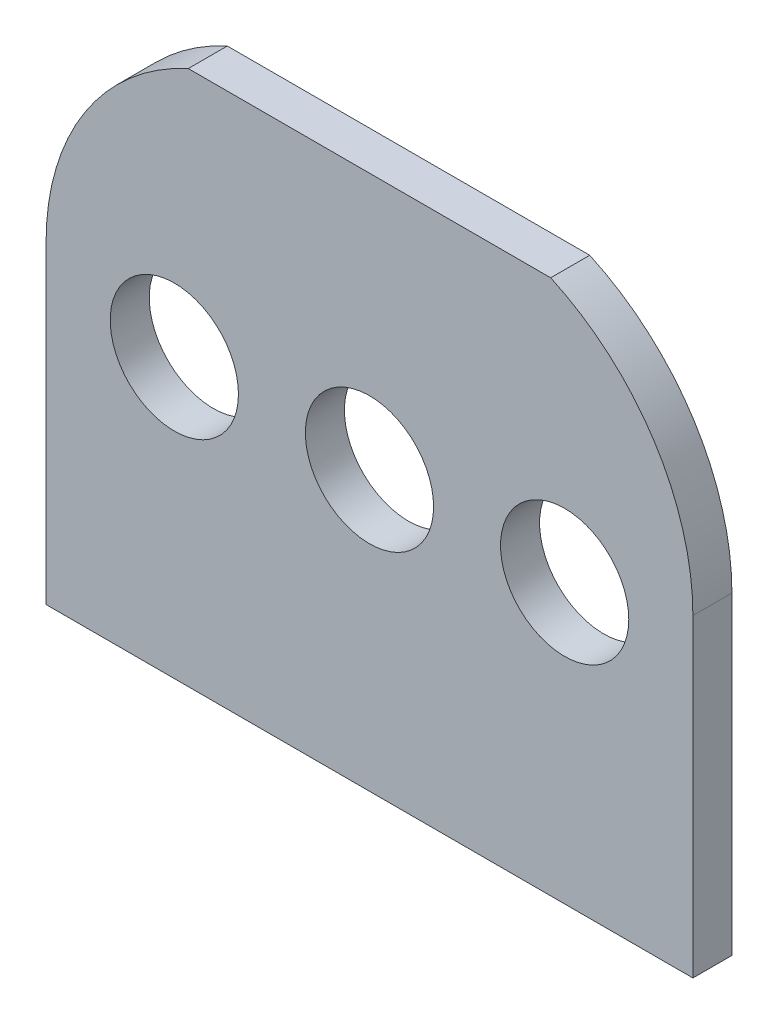
ISO-10303-21;
HEADER;
FILE_DESCRIPTION(('STEP AP214'),'2;1');
FILE_NAME('part.step','',(''),(''),'','','');
FILE_SCHEMA(('AUTOMOTIVE_DESIGN { 1 0 10303 214 1 1 1 1 }'));
ENDSEC;
DATA;
#1=APPLICATION_CONTEXT('core data for automotive mechanical design processes');
#2=APPLICATION_PROTOCOL_DEFINITION('international standard','automotive_design',2000,#1);
#3=PRODUCT_CONTEXT('',#1,'mechanical');
#4=PRODUCT('Part','Part','',(#3));
#5=PRODUCT_RELATED_PRODUCT_CATEGORY('part','',(#4));
#6=PRODUCT_DEFINITION_FORMATION('','',#4);
#7=PRODUCT_DEFINITION_CONTEXT('part definition',#1,'design');
#8=PRODUCT_DEFINITION('design','',#6,#7);
#9=PRODUCT_DEFINITION_SHAPE('','',#8);
#10=(LENGTH_UNIT() NAMED_UNIT(*) SI_UNIT(.MILLI.,.METRE.));
#11=(NAMED_UNIT(*) PLANE_ANGLE_UNIT() SI_UNIT($,.RADIAN.));
#12=(NAMED_UNIT(*) SI_UNIT($,.STERADIAN.) SOLID_ANGLE_UNIT());
#13=UNCERTAINTY_MEASURE_WITH_UNIT(LENGTH_MEASURE(1.E-05),#10,'distance_accuracy_value','');
#14=(GEOMETRIC_REPRESENTATION_CONTEXT(3) GLOBAL_UNCERTAINTY_ASSIGNED_CONTEXT((#13)) GLOBAL_UNIT_ASSIGNED_CONTEXT((#10,
#11,#12)) REPRESENTATION_CONTEXT('',''));
#15=CARTESIAN_POINT('',(0.,0.,0.));
#16=DIRECTION('',(0.,0.,1.));
#17=DIRECTION('',(1.,0.,0.));
#18=AXIS2_PLACEMENT_3D('',#15,#16,#17);
#19=CARTESIAN_POINT('',(1.43310760515362,0.63488027007446,0.7));
#20=DIRECTION('',(0.,0.,1.));
#21=DIRECTION('',(1.,0.,0.));
#22=AXIS2_PLACEMENT_3D('',#19,#20,#21);
#23=PLANE('',#22);
#24=CARTESIAN_POINT('',(3.5,0.,0.7));
#25=DIRECTION('',(0.,0.,1.));
#26=DIRECTION('',(1.,0.,0.));
#27=AXIS2_PLACEMENT_3D('',#24,#25,#26);
#28=CIRCLE('',#27,1.15);
#29=CARTESIAN_POINT('',(4.65,0.,0.7));
#30=VERTEX_POINT('',#29);
#31=EDGE_CURVE('E185',#30,#30,#28,.T.);
#32=ORIENTED_EDGE('',*,*,#31,.F.);
#33=EDGE_LOOP('',(#32));
#34=FACE_BOUND('',#33,.T.);
#35=DIRECTION('',(0.,-1.,0.));
#36=VECTOR('',#35,1.);
#37=CARTESIAN_POINT('',(-5.8,0.63488027007446,0.7));
#38=LINE('',#37,#36);
#39=CARTESIAN_POINT('',(-5.8,0.634880270074461,0.7));
#40=VERTEX_POINT('',#39);
#41=CARTESIAN_POINT('',(-5.8,-4.99414362653276,0.7));
#42=VERTEX_POINT('',#41);
#43=EDGE_CURVE('E130',#40,#42,#38,.T.);
#44=ORIENTED_EDGE('',*,*,#43,.T.);
#45=DIRECTION('',(1.,0.,0.));
#46=VECTOR('',#45,1.);
#47=CARTESIAN_POINT('',(-5.8,-4.99414362653276,0.7));
#48=LINE('',#47,#46);
#49=CARTESIAN_POINT('',(5.8,-4.99414362653276,0.7));
#50=VERTEX_POINT('',#49);
#51=EDGE_CURVE('E88',#42,#50,#48,.T.);
#52=ORIENTED_EDGE('',*,*,#51,.T.);
#53=DIRECTION('',(0.,1.,0.));
#54=VECTOR('',#53,1.);
#55=CARTESIAN_POINT('',(5.8,-4.99414362653276,0.7));
#56=LINE('',#55,#54);
#57=CARTESIAN_POINT('',(5.8,0.63488027007446,0.7));
#58=VERTEX_POINT('',#57);
#59=EDGE_CURVE('E101',#50,#58,#56,.T.);
#60=ORIENTED_EDGE('',*,*,#59,.T.);
#61=CARTESIAN_POINT('',(1.43310760515362,0.63488027007446,0.7));
#62=DIRECTION('',(0.,0.,1.));
#63=DIRECTION('',(1.,0.,0.));
#64=AXIS2_PLACEMENT_3D('',#61,#62,#63);
#65=CIRCLE('',#64,4.36689239484638);
#66=CARTESIAN_POINT('',(3.25,4.60585637346724,0.7));
#67=VERTEX_POINT('',#66);
#68=EDGE_CURVE('E95',#58,#67,#65,.T.);
#69=ORIENTED_EDGE('',*,*,#68,.T.);
#70=DIRECTION('',(-1.,0.,0.));
#71=VECTOR('',#70,1.);
#72=CARTESIAN_POINT('',(3.25,4.60585637346724,0.7));
#73=LINE('',#72,#71);
#74=CARTESIAN_POINT('',(-3.25,4.60585637346724,0.7));
#75=VERTEX_POINT('',#74);
#76=EDGE_CURVE('E99',#67,#75,#73,.T.);
#77=ORIENTED_EDGE('',*,*,#76,.T.);
#78=CARTESIAN_POINT('',(-1.43310760515362,0.63488027007446,0.7));
#79=DIRECTION('',(0.,0.,1.));
#80=DIRECTION('',(1.,0.,0.));
#81=AXIS2_PLACEMENT_3D('',#78,#79,#80);
#82=CIRCLE('',#81,4.36689239484638);
#83=EDGE_CURVE('E51',#75,#40,#82,.T.);
#84=ORIENTED_EDGE('',*,*,#83,.T.);
#85=EDGE_LOOP('',(#44,#52,#60,#69,#77,#84));
#86=FACE_BOUND('',#85,.T.);
#87=CARTESIAN_POINT('',(0.,0.,0.7));
#88=DIRECTION('',(0.,0.,1.));
#89=DIRECTION('',(1.,0.,0.));
#90=AXIS2_PLACEMENT_3D('',#87,#88,#89);
#91=CIRCLE('',#90,1.15);
#92=CARTESIAN_POINT('',(1.15,0.,0.7));
#93=VERTEX_POINT('',#92);
#94=EDGE_CURVE('E123',#93,#93,#91,.T.);
#95=ORIENTED_EDGE('',*,*,#94,.F.);
#96=EDGE_LOOP('',(#95));
#97=FACE_BOUND('',#96,.T.);
#98=CARTESIAN_POINT('',(-3.5,0.,0.7));
#99=DIRECTION('',(0.,0.,1.));
#100=DIRECTION('',(1.,0.,0.));
#101=AXIS2_PLACEMENT_3D('',#98,#99,#100);
#102=CIRCLE('',#101,1.15);
#103=CARTESIAN_POINT('',(-2.35,0.,0.7));
#104=VERTEX_POINT('',#103);
#105=EDGE_CURVE('E176',#104,#104,#102,.T.);
#106=ORIENTED_EDGE('',*,*,#105,.F.);
#107=EDGE_LOOP('',(#106));
#108=FACE_BOUND('',#107,.T.);
#109=ADVANCED_FACE('F34',(#34,#86,#97,#108),#23,.T.);
#110=CARTESIAN_POINT('',(1.43310760515362,0.63488027007446,0.));
#111=DIRECTION('',(0.,0.,1.));
#112=DIRECTION('',(1.,0.,0.));
#113=AXIS2_PLACEMENT_3D('',#110,#111,#112);
#114=PLANE('',#113);
#115=DIRECTION('',(0.,-1.,0.));
#116=VECTOR('',#115,1.);
#117=CARTESIAN_POINT('',(-5.8,0.63488027007446,0.));
#118=LINE('',#117,#116);
#119=CARTESIAN_POINT('',(-5.8,0.634880270074461,0.));
#120=VERTEX_POINT('',#119);
#121=CARTESIAN_POINT('',(-5.8,-4.99414362653276,0.));
#122=VERTEX_POINT('',#121);
#123=EDGE_CURVE('E119',#120,#122,#118,.T.);
#124=ORIENTED_EDGE('',*,*,#123,.F.);
#125=CARTESIAN_POINT('',(-1.43310760515362,0.63488027007446,0.));
#126=DIRECTION('',(0.,0.,1.));
#127=DIRECTION('',(1.,0.,0.));
#128=AXIS2_PLACEMENT_3D('',#125,#126,#127);
#129=CIRCLE('',#128,4.36689239484638);
#130=CARTESIAN_POINT('',(-3.25,4.60585637346724,0.));
#131=VERTEX_POINT('',#130);
#132=EDGE_CURVE('E80',#131,#120,#129,.T.);
#133=ORIENTED_EDGE('',*,*,#132,.F.);
#134=DIRECTION('',(-1.,0.,0.));
#135=VECTOR('',#134,1.);
#136=CARTESIAN_POINT('',(3.25,4.60585637346724,0.));
#137=LINE('',#136,#135);
#138=CARTESIAN_POINT('',(3.25,4.60585637346724,0.));
#139=VERTEX_POINT('',#138);
#140=EDGE_CURVE('E74',#139,#131,#137,.T.);
#141=ORIENTED_EDGE('',*,*,#140,.F.);
#142=CARTESIAN_POINT('',(1.43310760515362,0.63488027007446,0.));
#143=DIRECTION('',(0.,0.,1.));
#144=DIRECTION('',(1.,0.,0.));
#145=AXIS2_PLACEMENT_3D('',#142,#143,#144);
#146=CIRCLE('',#145,4.36689239484638);
#147=CARTESIAN_POINT('',(5.8,0.63488027007446,0.));
#148=VERTEX_POINT('',#147);
#149=EDGE_CURVE('E109',#148,#139,#146,.T.);
#150=ORIENTED_EDGE('',*,*,#149,.F.);
#151=DIRECTION('',(0.,1.,0.));
#152=VECTOR('',#151,1.);
#153=CARTESIAN_POINT('',(5.8,-4.99414362653276,0.));
#154=LINE('',#153,#152);
#155=CARTESIAN_POINT('',(5.8,-4.99414362653276,0.));
#156=VERTEX_POINT('',#155);
#157=EDGE_CURVE('E125',#156,#148,#154,.T.);
#158=ORIENTED_EDGE('',*,*,#157,.F.);
#159=DIRECTION('',(1.,0.,0.));
#160=VECTOR('',#159,1.);
#161=CARTESIAN_POINT('',(-5.8,-4.99414362653276,0.));
#162=LINE('',#161,#160);
#163=EDGE_CURVE('E122',#122,#156,#162,.T.);
#164=ORIENTED_EDGE('',*,*,#163,.F.);
#165=EDGE_LOOP('',(#124,#133,#141,#150,#158,#164));
#166=FACE_BOUND('',#165,.T.);
#167=CARTESIAN_POINT('',(0.,0.,0.));
#168=DIRECTION('',(0.,0.,1.));
#169=DIRECTION('',(1.,0.,0.));
#170=AXIS2_PLACEMENT_3D('',#167,#168,#169);
#171=CIRCLE('',#170,1.15);
#172=CARTESIAN_POINT('',(1.15,0.,0.));
#173=VERTEX_POINT('',#172);
#174=EDGE_CURVE('E188',#173,#173,#171,.T.);
#175=ORIENTED_EDGE('',*,*,#174,.T.);
#176=EDGE_LOOP('',(#175));
#177=FACE_BOUND('',#176,.T.);
#178=CARTESIAN_POINT('',(3.5,0.,0.));
#179=DIRECTION('',(0.,0.,1.));
#180=DIRECTION('',(1.,0.,0.));
#181=AXIS2_PLACEMENT_3D('',#178,#179,#180);
#182=CIRCLE('',#181,1.15);
#183=CARTESIAN_POINT('',(4.65,0.,0.));
#184=VERTEX_POINT('',#183);
#185=EDGE_CURVE('E182',#184,#184,#182,.T.);
#186=ORIENTED_EDGE('',*,*,#185,.T.);
#187=EDGE_LOOP('',(#186));
#188=FACE_BOUND('',#187,.T.);
#189=CARTESIAN_POINT('',(-3.5,0.,0.));
#190=DIRECTION('',(0.,0.,1.));
#191=DIRECTION('',(1.,0.,0.));
#192=AXIS2_PLACEMENT_3D('',#189,#190,#191);
#193=CIRCLE('',#192,1.15);
#194=CARTESIAN_POINT('',(-2.35,0.,0.));
#195=VERTEX_POINT('',#194);
#196=EDGE_CURVE('E179',#195,#195,#193,.T.);
#197=ORIENTED_EDGE('',*,*,#196,.T.);
#198=EDGE_LOOP('',(#197));
#199=FACE_BOUND('',#198,.T.);
#200=ADVANCED_FACE('F139',(#166,#177,#188,#199),#114,.F.);
#201=CARTESIAN_POINT('',(-5.8,0.63488027007446,0.7));
#202=DIRECTION('',(1.,0.,0.));
#203=DIRECTION('',(0.,0.,-1.));
#204=AXIS2_PLACEMENT_3D('',#201,#202,#203);
#205=PLANE('',#204);
#206=ORIENTED_EDGE('',*,*,#123,.T.);
#207=DIRECTION('',(0.,0.,-1.));
#208=VECTOR('',#207,1.);
#209=CARTESIAN_POINT('',(-5.8,-4.99414362653276,0.7));
#210=LINE('',#209,#208);
#211=EDGE_CURVE('E11',#42,#122,#210,.T.);
#212=ORIENTED_EDGE('',*,*,#211,.F.);
#213=ORIENTED_EDGE('',*,*,#43,.F.);
#214=DIRECTION('',(0.,0.,-1.));
#215=VECTOR('',#214,1.);
#216=CARTESIAN_POINT('',(-5.8,0.634880270074461,0.7));
#217=LINE('',#216,#215);
#218=EDGE_CURVE('E115',#40,#120,#217,.T.);
#219=ORIENTED_EDGE('',*,*,#218,.T.);
#220=EDGE_LOOP('',(#206,#212,#213,#219));
#221=FACE_BOUND('',#220,.T.);
#222=ADVANCED_FACE('F36',(#221),#205,.F.);
#223=CARTESIAN_POINT('',(-5.8,-4.99414362653276,0.7));
#224=DIRECTION('',(0.,1.,0.));
#225=DIRECTION('',(0.,0.,1.));
#226=AXIS2_PLACEMENT_3D('',#223,#224,#225);
#227=PLANE('',#226);
#228=ORIENTED_EDGE('',*,*,#163,.T.);
#229=DIRECTION('',(0.,0.,-1.));
#230=VECTOR('',#229,1.);
#231=CARTESIAN_POINT('',(5.8,-4.99414362653276,0.7));
#232=LINE('',#231,#230);
#233=EDGE_CURVE('E43',#50,#156,#232,.T.);
#234=ORIENTED_EDGE('',*,*,#233,.F.);
#235=ORIENTED_EDGE('',*,*,#51,.F.);
#236=ORIENTED_EDGE('',*,*,#211,.T.);
#237=EDGE_LOOP('',(#228,#234,#235,#236));
#238=FACE_BOUND('',#237,.T.);
#239=ADVANCED_FACE('F221',(#238),#227,.F.);
#240=CARTESIAN_POINT('',(5.8,-4.99414362653276,0.7));
#241=DIRECTION('',(-1.,0.,0.));
#242=DIRECTION('',(0.,0.,1.));
#243=AXIS2_PLACEMENT_3D('',#240,#241,#242);
#244=PLANE('',#243);
#245=ORIENTED_EDGE('',*,*,#157,.T.);
#246=DIRECTION('',(0.,0.,-1.));
#247=VECTOR('',#246,1.);
#248=CARTESIAN_POINT('',(5.8,0.63488027007446,0.7));
#249=LINE('',#248,#247);
#250=EDGE_CURVE('E110',#58,#148,#249,.T.);
#251=ORIENTED_EDGE('',*,*,#250,.F.);
#252=ORIENTED_EDGE('',*,*,#59,.F.);
#253=ORIENTED_EDGE('',*,*,#233,.T.);
#254=EDGE_LOOP('',(#245,#251,#252,#253));
#255=FACE_BOUND('',#254,.T.);
#256=ADVANCED_FACE('F136',(#255),#244,.F.);
#257=CARTESIAN_POINT('',(1.43310760515362,0.63488027007446,0.7));
#258=DIRECTION('',(0.,0.,-1.));
#259=DIRECTION('',(-1.,0.,0.));
#260=AXIS2_PLACEMENT_3D('',#257,#258,#259);
#261=CYLINDRICAL_SURFACE('',#260,4.36689239484638);
#262=ORIENTED_EDGE('',*,*,#149,.T.);
#263=DIRECTION('',(0.,0.,-1.));
#264=VECTOR('',#263,1.);
#265=CARTESIAN_POINT('',(3.25,4.60585637346724,0.7));
#266=LINE('',#265,#264);
#267=EDGE_CURVE('E106',#67,#139,#266,.T.);
#268=ORIENTED_EDGE('',*,*,#267,.F.);
#269=ORIENTED_EDGE('',*,*,#68,.F.);
#270=ORIENTED_EDGE('',*,*,#250,.T.);
#271=EDGE_LOOP('',(#262,#268,#269,#270));
#272=FACE_BOUND('',#271,.T.);
#273=ADVANCED_FACE('F107',(#272),#261,.T.);
#274=CARTESIAN_POINT('',(3.25,4.60585637346724,0.7));
#275=DIRECTION('',(0.,-1.,0.));
#276=DIRECTION('',(0.,0.,-1.));
#277=AXIS2_PLACEMENT_3D('',#274,#275,#276);
#278=PLANE('',#277);
#279=ORIENTED_EDGE('',*,*,#140,.T.);
#280=DIRECTION('',(0.,0.,-1.));
#281=VECTOR('',#280,1.);
#282=CARTESIAN_POINT('',(-3.25,4.60585637346724,0.7));
#283=LINE('',#282,#281);
#284=EDGE_CURVE('E111',#75,#131,#283,.T.);
#285=ORIENTED_EDGE('',*,*,#284,.F.);
#286=ORIENTED_EDGE('',*,*,#76,.F.);
#287=ORIENTED_EDGE('',*,*,#267,.T.);
#288=EDGE_LOOP('',(#279,#285,#286,#287));
#289=FACE_BOUND('',#288,.T.);
#290=ADVANCED_FACE('F113',(#289),#278,.F.);
#291=CARTESIAN_POINT('',(-1.43310760515362,0.63488027007446,0.7));
#292=DIRECTION('',(0.,0.,-1.));
#293=DIRECTION('',(-1.,0.,0.));
#294=AXIS2_PLACEMENT_3D('',#291,#292,#293);
#295=CYLINDRICAL_SURFACE('',#294,4.36689239484638);
#296=ORIENTED_EDGE('',*,*,#132,.T.);
#297=ORIENTED_EDGE('',*,*,#218,.F.);
#298=ORIENTED_EDGE('',*,*,#83,.F.);
#299=ORIENTED_EDGE('',*,*,#284,.T.);
#300=EDGE_LOOP('',(#296,#297,#298,#299));
#301=FACE_BOUND('',#300,.T.);
#302=ADVANCED_FACE('F144',(#301),#295,.T.);
#303=CARTESIAN_POINT('',(0.,0.,0.7));
#304=DIRECTION('',(0.,0.,-1.));
#305=DIRECTION('',(-1.,0.,0.));
#306=AXIS2_PLACEMENT_3D('',#303,#304,#305);
#307=CYLINDRICAL_SURFACE('',#306,1.15);
#308=ORIENTED_EDGE('',*,*,#94,.T.);
#309=EDGE_LOOP('',(#308));
#310=FACE_BOUND('',#309,.T.);
#311=ORIENTED_EDGE('',*,*,#174,.F.);
#312=EDGE_LOOP('',(#311));
#313=FACE_BOUND('',#312,.T.);
#314=ADVANCED_FACE('F146',(#310,#313),#307,.F.);
#315=CARTESIAN_POINT('',(3.5,0.,0.7));
#316=DIRECTION('',(0.,0.,-1.));
#317=DIRECTION('',(-1.,0.,0.));
#318=AXIS2_PLACEMENT_3D('',#315,#316,#317);
#319=CYLINDRICAL_SURFACE('',#318,1.15);
#320=ORIENTED_EDGE('',*,*,#31,.T.);
#321=EDGE_LOOP('',(#320));
#322=FACE_BOUND('',#321,.T.);
#323=ORIENTED_EDGE('',*,*,#185,.F.);
#324=EDGE_LOOP('',(#323));
#325=FACE_BOUND('',#324,.T.);
#326=ADVANCED_FACE('F152',(#322,#325),#319,.F.);
#327=CARTESIAN_POINT('',(-3.5,0.,0.7));
#328=DIRECTION('',(0.,0.,-1.));
#329=DIRECTION('',(-1.,0.,0.));
#330=AXIS2_PLACEMENT_3D('',#327,#328,#329);
#331=CYLINDRICAL_SURFACE('',#330,1.15);
#332=ORIENTED_EDGE('',*,*,#105,.T.);
#333=EDGE_LOOP('',(#332));
#334=FACE_BOUND('',#333,.T.);
#335=ORIENTED_EDGE('',*,*,#196,.F.);
#336=EDGE_LOOP('',(#335));
#337=FACE_BOUND('',#336,.T.);
#338=ADVANCED_FACE('F167',(#334,#337),#331,.F.);
#339=CLOSED_SHELL('',(#109,#200,#222,#239,#256,#273,#290,#302,#314,#326,#338));
#340=MANIFOLD_SOLID_BREP('B2',#339);
#341=ADVANCED_BREP_SHAPE_REPRESENTATION('',(#18,#340),#14);
#342=SHAPE_DEFINITION_REPRESENTATION(#9,#341);
ENDSEC;
END-ISO-10303-21;
